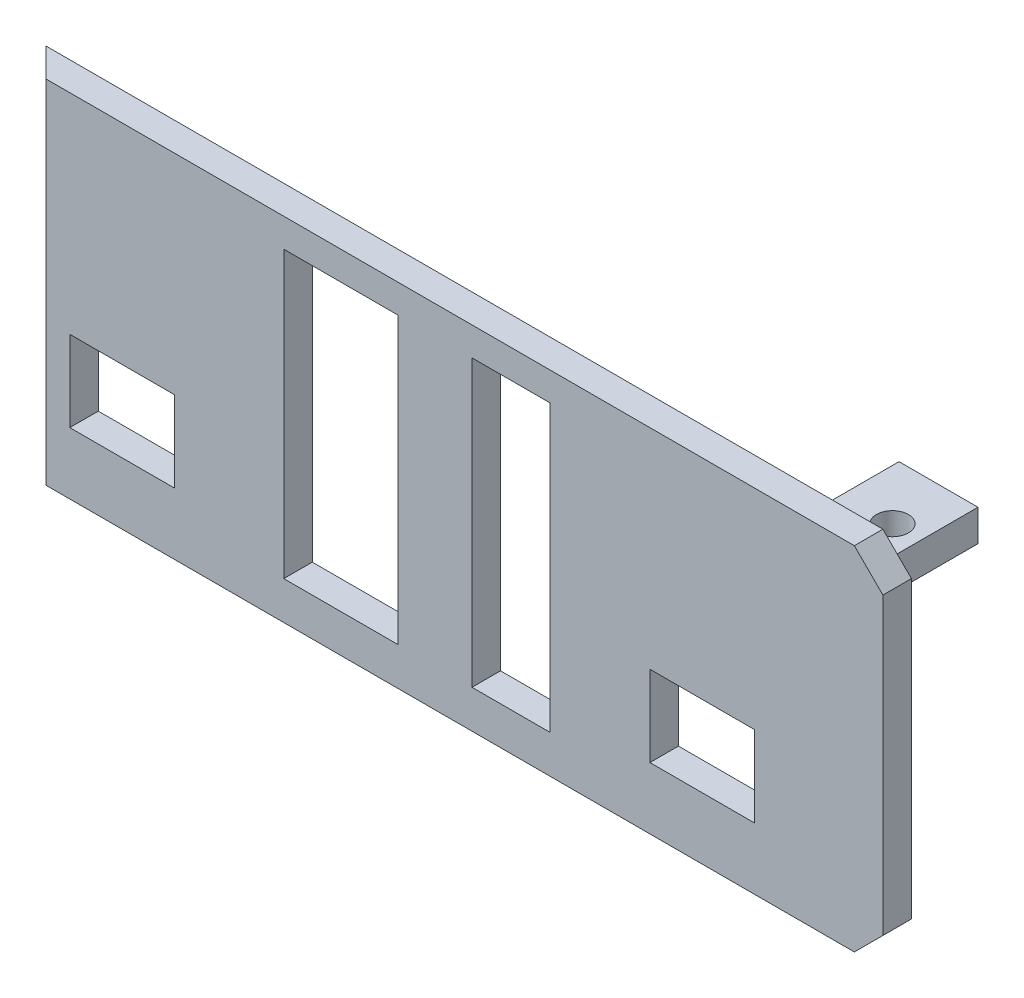
ISO-10303-21;
HEADER;
FILE_DESCRIPTION(('STEP AP214'),'2;1');
FILE_NAME('part.step','',(''),(''),'','','');
FILE_SCHEMA(('AUTOMOTIVE_DESIGN { 1 0 10303 214 1 1 1 1 }'));
ENDSEC;
DATA;
#1=APPLICATION_CONTEXT('core data for automotive mechanical design processes');
#2=APPLICATION_PROTOCOL_DEFINITION('international standard','automotive_design',2000,#1);
#3=PRODUCT_CONTEXT('',#1,'mechanical');
#4=PRODUCT('Part','Part','',(#3));
#5=PRODUCT_RELATED_PRODUCT_CATEGORY('part','',(#4));
#6=PRODUCT_DEFINITION_FORMATION('','',#4);
#7=PRODUCT_DEFINITION_CONTEXT('part definition',#1,'design');
#8=PRODUCT_DEFINITION('design','',#6,#7);
#9=PRODUCT_DEFINITION_SHAPE('','',#8);
#10=(LENGTH_UNIT() NAMED_UNIT(*) SI_UNIT(.MILLI.,.METRE.));
#11=(NAMED_UNIT(*) PLANE_ANGLE_UNIT() SI_UNIT($,.RADIAN.));
#12=(NAMED_UNIT(*) SI_UNIT($,.STERADIAN.) SOLID_ANGLE_UNIT());
#13=UNCERTAINTY_MEASURE_WITH_UNIT(LENGTH_MEASURE(1.E-05),#10,'distance_accuracy_value','');
#14=(GEOMETRIC_REPRESENTATION_CONTEXT(3) GLOBAL_UNCERTAINTY_ASSIGNED_CONTEXT((#13)) GLOBAL_UNIT_ASSIGNED_CONTEXT((#10,
#11,#12)) REPRESENTATION_CONTEXT('',''));
#15=CARTESIAN_POINT('',(0.,0.,0.));
#16=DIRECTION('',(0.,0.,1.));
#17=DIRECTION('',(1.,0.,0.));
#18=AXIS2_PLACEMENT_3D('',#15,#16,#17);
#19=CARTESIAN_POINT('',(0.,0.,0.));
#20=DIRECTION('',(0.,0.,-1.));
#21=DIRECTION('',(-1.,0.,0.));
#22=AXIS2_PLACEMENT_3D('',#19,#20,#21);
#23=PLANE('',#22);
#24=DIRECTION('',(0.,1.,0.));
#25=VECTOR('',#24,1.);
#26=CARTESIAN_POINT('',(-17.5000000000004,15.4999999999999,0.));
#27=LINE('',#26,#25);
#28=CARTESIAN_POINT('',(-17.5000000000004,-14.5,0.));
#29=VERTEX_POINT('',#28);
#30=CARTESIAN_POINT('',(-17.5000000000004,15.4999999999999,0.));
#31=VERTEX_POINT('',#30);
#32=EDGE_CURVE('E252',#29,#31,#27,.T.);
#33=ORIENTED_EDGE('',*,*,#32,.F.);
#34=DIRECTION('',(-1.,0.,0.));
#35=VECTOR('',#34,1.);
#36=CARTESIAN_POINT('',(-17.5000000000004,-14.5,0.));
#37=LINE('',#36,#35);
#38=CARTESIAN_POINT('',(-5.49999999999989,-14.5,0.));
#39=VERTEX_POINT('',#38);
#40=EDGE_CURVE('E261',#39,#29,#37,.T.);
#41=ORIENTED_EDGE('',*,*,#40,.F.);
#42=DIRECTION('',(0.,-1.,0.));
#43=VECTOR('',#42,1.);
#44=CARTESIAN_POINT('',(-5.49999999999988,15.5,0.));
#45=LINE('',#44,#43);
#46=CARTESIAN_POINT('',(-5.49999999999988,15.5,0.));
#47=VERTEX_POINT('',#46);
#48=EDGE_CURVE('E258',#47,#39,#45,.T.);
#49=ORIENTED_EDGE('',*,*,#48,.F.);
#50=DIRECTION('',(1.,0.,0.));
#51=VECTOR('',#50,1.);
#52=CARTESIAN_POINT('',(-17.5000000000004,15.4999999999999,0.));
#53=LINE('',#52,#51);
#54=EDGE_CURVE('E254',#31,#47,#53,.T.);
#55=ORIENTED_EDGE('',*,*,#54,.F.);
#56=EDGE_LOOP('',(#33,#41,#49,#55));
#57=FACE_BOUND('',#56,.T.);
#58=DIRECTION('',(0.,1.,0.));
#59=VECTOR('',#58,1.);
#60=CARTESIAN_POINT('',(2.29246455860621,15.5,0.));
#61=LINE('',#60,#59);
#62=CARTESIAN_POINT('',(2.29246455860621,-14.5,0.));
#63=VERTEX_POINT('',#62);
#64=CARTESIAN_POINT('',(2.29246455860621,15.5,0.));
#65=VERTEX_POINT('',#64);
#66=EDGE_CURVE('E255',#63,#65,#61,.T.);
#67=ORIENTED_EDGE('',*,*,#66,.F.);
#68=DIRECTION('',(-1.,0.,0.));
#69=VECTOR('',#68,1.);
#70=CARTESIAN_POINT('',(2.29246455860621,-14.5,0.));
#71=LINE('',#70,#69);
#72=CARTESIAN_POINT('',(10.5000000000001,-14.5,0.));
#73=VERTEX_POINT('',#72);
#74=EDGE_CURVE('E277',#73,#63,#71,.T.);
#75=ORIENTED_EDGE('',*,*,#74,.F.);
#76=DIRECTION('',(0.,-1.,0.));
#77=VECTOR('',#76,1.);
#78=CARTESIAN_POINT('',(10.5000000000001,15.5,0.));
#79=LINE('',#78,#77);
#80=CARTESIAN_POINT('',(10.5000000000001,15.5,0.));
#81=VERTEX_POINT('',#80);
#82=EDGE_CURVE('E283',#81,#73,#79,.T.);
#83=ORIENTED_EDGE('',*,*,#82,.F.);
#84=DIRECTION('',(1.,0.,0.));
#85=VECTOR('',#84,1.);
#86=CARTESIAN_POINT('',(2.29246455860621,15.5,0.));
#87=LINE('',#86,#85);
#88=EDGE_CURVE('E286',#65,#81,#87,.T.);
#89=ORIENTED_EDGE('',*,*,#88,.F.);
#90=EDGE_LOOP('',(#67,#75,#83,#89));
#91=FACE_BOUND('',#90,.T.);
#92=DIRECTION('',(0.,1.,0.));
#93=VECTOR('',#92,1.);
#94=CARTESIAN_POINT('',(-40.,0.,0.));
#95=LINE('',#94,#93);
#96=CARTESIAN_POINT('',(-40.,-11.9999999999999,0.));
#97=VERTEX_POINT('',#96);
#98=CARTESIAN_POINT('',(-40.,-3.49999999999987,0.));
#99=VERTEX_POINT('',#98);
#100=EDGE_CURVE('E392',#97,#99,#95,.T.);
#101=ORIENTED_EDGE('',*,*,#100,.F.);
#102=DIRECTION('',(-1.,0.,0.));
#103=VECTOR('',#102,1.);
#104=CARTESIAN_POINT('',(0.,-11.9999999999999,0.));
#105=LINE('',#104,#103);
#106=CARTESIAN_POINT('',(-29.,-11.9999999999999,0.));
#107=VERTEX_POINT('',#106);
#108=EDGE_CURVE('E385',#107,#97,#105,.T.);
#109=ORIENTED_EDGE('',*,*,#108,.F.);
#110=DIRECTION('',(0.,-1.,0.));
#111=VECTOR('',#110,1.);
#112=CARTESIAN_POINT('',(-29.,0.,0.));
#113=LINE('',#112,#111);
#114=CARTESIAN_POINT('',(-29.,-3.49999999999987,0.));
#115=VERTEX_POINT('',#114);
#116=EDGE_CURVE('E387',#115,#107,#113,.T.);
#117=ORIENTED_EDGE('',*,*,#116,.F.);
#118=DIRECTION('',(1.,0.,0.));
#119=VECTOR('',#118,1.);
#120=CARTESIAN_POINT('',(0.,-3.49999999999987,0.));
#121=LINE('',#120,#119);
#122=EDGE_CURVE('E390',#99,#115,#121,.T.);
#123=ORIENTED_EDGE('',*,*,#122,.F.);
#124=EDGE_LOOP('',(#101,#109,#117,#123));
#125=FACE_BOUND('',#124,.T.);
#126=DIRECTION('',(0.,1.,0.));
#127=VECTOR('',#126,1.);
#128=CARTESIAN_POINT('',(21.0000000000001,0.,0.));
#129=LINE('',#128,#127);
#130=CARTESIAN_POINT('',(21.0000000000001,-11.9999999999998,0.));
#131=VERTEX_POINT('',#130);
#132=CARTESIAN_POINT('',(21.0000000000001,-3.49999999999983,0.));
#133=VERTEX_POINT('',#132);
#134=EDGE_CURVE('E383',#131,#133,#129,.T.);
#135=ORIENTED_EDGE('',*,*,#134,.F.);
#136=DIRECTION('',(-1.,0.,0.));
#137=VECTOR('',#136,1.);
#138=CARTESIAN_POINT('',(0.,-11.9999999999998,0.));
#139=LINE('',#138,#137);
#140=CARTESIAN_POINT('',(32.0000000000001,-11.9999999999998,0.));
#141=VERTEX_POINT('',#140);
#142=EDGE_CURVE('E376',#141,#131,#139,.T.);
#143=ORIENTED_EDGE('',*,*,#142,.F.);
#144=DIRECTION('',(0.,-1.,0.));
#145=VECTOR('',#144,1.);
#146=CARTESIAN_POINT('',(32.0000000000001,0.,0.));
#147=LINE('',#146,#145);
#148=CARTESIAN_POINT('',(32.0000000000001,-3.49999999999983,0.));
#149=VERTEX_POINT('',#148);
#150=EDGE_CURVE('E378',#149,#141,#147,.T.);
#151=ORIENTED_EDGE('',*,*,#150,.F.);
#152=DIRECTION('',(1.,0.,0.));
#153=VECTOR('',#152,1.);
#154=CARTESIAN_POINT('',(0.,-3.49999999999984,0.));
#155=LINE('',#154,#153);
#156=EDGE_CURVE('E381',#133,#149,#155,.T.);
#157=ORIENTED_EDGE('',*,*,#156,.F.);
#158=EDGE_LOOP('',(#135,#143,#151,#157));
#159=FACE_BOUND('',#158,.T.);
#160=DIRECTION('',(0.,1.,0.));
#161=VECTOR('',#160,1.);
#162=CARTESIAN_POINT('',(45.5,-18.5,0.));
#163=LINE('',#162,#161);
#164=CARTESIAN_POINT('',(45.5,-15.5,0.));
#165=VERTEX_POINT('',#164);
#166=CARTESIAN_POINT('',(45.5,15.5,0.));
#167=VERTEX_POINT('',#166);
#168=EDGE_CURVE('E329',#165,#167,#163,.T.);
#169=ORIENTED_EDGE('',*,*,#168,.F.);
#170=DIRECTION('',(0.707106781186549,0.707106781186546,0.));
#171=VECTOR('',#170,1.);
#172=CARTESIAN_POINT('',(30.4999999999999,-30.5,0.));
#173=LINE('',#172,#171);
#174=CARTESIAN_POINT('',(42.5,-18.5,0.));
#175=VERTEX_POINT('',#174);
#176=EDGE_CURVE('E68',#165,#175,#173,.F.);
#177=ORIENTED_EDGE('',*,*,#176,.T.);
#178=DIRECTION('',(1.,0.,0.));
#179=VECTOR('',#178,1.);
#180=CARTESIAN_POINT('',(-45.5,-18.5,0.));
#181=LINE('',#180,#179);
#182=CARTESIAN_POINT('',(-45.5,-18.5,0.));
#183=VERTEX_POINT('',#182);
#184=EDGE_CURVE('E357',#183,#175,#181,.T.);
#185=ORIENTED_EDGE('',*,*,#184,.F.);
#186=DIRECTION('',(0.,-1.,0.));
#187=VECTOR('',#186,1.);
#188=CARTESIAN_POINT('',(-45.5,-18.5,0.));
#189=LINE('',#188,#187);
#190=CARTESIAN_POINT('',(-45.5,18.5,0.));
#191=VERTEX_POINT('',#190);
#192=EDGE_CURVE('E365',#191,#183,#189,.T.);
#193=ORIENTED_EDGE('',*,*,#192,.F.);
#194=DIRECTION('',(-1.,0.,0.));
#195=VECTOR('',#194,1.);
#196=CARTESIAN_POINT('',(-45.5,18.5,0.));
#197=LINE('',#196,#195);
#198=CARTESIAN_POINT('',(42.5,18.5,0.));
#199=VERTEX_POINT('',#198);
#200=EDGE_CURVE('E363',#199,#191,#197,.T.);
#201=ORIENTED_EDGE('',*,*,#200,.F.);
#202=DIRECTION('',(-0.707106781186544,0.707106781186551,0.));
#203=VECTOR('',#202,1.);
#204=CARTESIAN_POINT('',(30.5000000000002,30.4999999999999,0.));
#205=LINE('',#204,#203);
#206=EDGE_CURVE('E397',#199,#167,#205,.F.);
#207=ORIENTED_EDGE('',*,*,#206,.T.);
#208=EDGE_LOOP('',(#169,#177,#185,#193,#201,#207));
#209=FACE_BOUND('',#208,.T.);
#210=DIRECTION('',(-1.,0.,0.));
#211=VECTOR('',#210,1.);
#212=CARTESIAN_POINT('',(42.5,12.1806871060608,0.));
#213=LINE('',#212,#211);
#214=CARTESIAN_POINT('',(42.5,12.1806871060608,0.));
#215=VERTEX_POINT('',#214);
#216=CARTESIAN_POINT('',(34.1946625321552,12.1806871060608,0.));
#217=VERTEX_POINT('',#216);
#218=EDGE_CURVE('E579',#215,#217,#213,.T.);
#219=ORIENTED_EDGE('',*,*,#218,.F.);
#220=DIRECTION('',(0.,-1.,0.));
#221=VECTOR('',#220,1.);
#222=CARTESIAN_POINT('',(42.5,15.5,0.));
#223=LINE('',#222,#221);
#224=CARTESIAN_POINT('',(42.5,15.5,0.));
#225=VERTEX_POINT('',#224);
#226=EDGE_CURVE('E242',#225,#215,#223,.T.);
#227=ORIENTED_EDGE('',*,*,#226,.F.);
#228=DIRECTION('',(1.,0.,0.));
#229=VECTOR('',#228,1.);
#230=CARTESIAN_POINT('',(42.5,15.5,0.));
#231=LINE('',#230,#229);
#232=CARTESIAN_POINT('',(34.1946625321552,15.5,0.));
#233=VERTEX_POINT('',#232);
#234=EDGE_CURVE('E238',#233,#225,#231,.T.);
#235=ORIENTED_EDGE('',*,*,#234,.F.);
#236=DIRECTION('',(0.,1.,0.));
#237=VECTOR('',#236,1.);
#238=CARTESIAN_POINT('',(34.1946625321552,15.5,0.));
#239=LINE('',#238,#237);
#240=EDGE_CURVE('E587',#217,#233,#239,.T.);
#241=ORIENTED_EDGE('',*,*,#240,.F.);
#242=EDGE_LOOP('',(#219,#227,#235,#241));
#243=FACE_BOUND('',#242,.T.);
#244=ADVANCED_FACE('F45',(#57,#91,#125,#159,#209,#243),#23,.T.);
#245=CARTESIAN_POINT('',(45.5,-18.5,3.));
#246=DIRECTION('',(-1.,0.,0.));
#247=DIRECTION('',(0.,0.,1.));
#248=AXIS2_PLACEMENT_3D('',#245,#246,#247);
#249=PLANE('',#248);
#250=DIRECTION('',(0.,1.,0.));
#251=VECTOR('',#250,1.);
#252=CARTESIAN_POINT('',(45.5,-18.5,3.));
#253=LINE('',#252,#251);
#254=CARTESIAN_POINT('',(45.5,-15.5,3.));
#255=VERTEX_POINT('',#254);
#256=CARTESIAN_POINT('',(45.5,15.5,3.));
#257=VERTEX_POINT('',#256);
#258=EDGE_CURVE('E354',#255,#257,#253,.T.);
#259=ORIENTED_EDGE('',*,*,#258,.F.);
#260=DIRECTION('',(0.,0.,-1.));
#261=VECTOR('',#260,1.);
#262=CARTESIAN_POINT('',(45.5,-15.5,3.));
#263=LINE('',#262,#261);
#264=EDGE_CURVE('E405',#255,#165,#263,.T.);
#265=ORIENTED_EDGE('',*,*,#264,.T.);
#266=ORIENTED_EDGE('',*,*,#168,.T.);
#267=DIRECTION('',(0.,0.,1.));
#268=VECTOR('',#267,1.);
#269=CARTESIAN_POINT('',(45.5,15.5,3.));
#270=LINE('',#269,#268);
#271=EDGE_CURVE('E400',#167,#257,#270,.T.);
#272=ORIENTED_EDGE('',*,*,#271,.T.);
#273=EDGE_LOOP('',(#259,#265,#266,#272));
#274=FACE_BOUND('',#273,.T.);
#275=ADVANCED_FACE('F411',(#274),#249,.F.);
#276=CARTESIAN_POINT('',(-45.5,18.5,3.));
#277=DIRECTION('',(0.,-1.,0.));
#278=DIRECTION('',(0.,0.,-1.));
#279=AXIS2_PLACEMENT_3D('',#276,#277,#278);
#280=PLANE('',#279);
#281=DIRECTION('',(-1.,0.,0.));
#282=VECTOR('',#281,1.);
#283=CARTESIAN_POINT('',(-45.5,18.5,3.));
#284=LINE('',#283,#282);
#285=CARTESIAN_POINT('',(42.5,18.5,3.));
#286=VERTEX_POINT('',#285);
#287=CARTESIAN_POINT('',(-42.5,18.5,3.));
#288=VERTEX_POINT('',#287);
#289=EDGE_CURVE('E356',#286,#288,#284,.T.);
#290=ORIENTED_EDGE('',*,*,#289,.F.);
#291=DIRECTION('',(0.,0.,-1.));
#292=VECTOR('',#291,1.);
#293=CARTESIAN_POINT('',(42.5,18.5,3.));
#294=LINE('',#293,#292);
#295=EDGE_CURVE('E394',#286,#199,#294,.T.);
#296=ORIENTED_EDGE('',*,*,#295,.T.);
#297=ORIENTED_EDGE('',*,*,#200,.T.);
#298=DIRECTION('',(-0.707106781186546,0.,-0.707106781186549));
#299=VECTOR('',#298,1.);
#300=CARTESIAN_POINT('',(-42.5,18.5,3.));
#301=LINE('',#300,#299);
#302=EDGE_CURVE('E373',#191,#288,#301,.F.);
#303=ORIENTED_EDGE('',*,*,#302,.T.);
#304=EDGE_LOOP('',(#290,#296,#297,#303));
#305=FACE_BOUND('',#304,.T.);
#306=ADVANCED_FACE('F426',(#305),#280,.F.);
#307=CARTESIAN_POINT('',(-45.5,-18.5,3.));
#308=DIRECTION('',(0.,1.,0.));
#309=DIRECTION('',(0.,0.,1.));
#310=AXIS2_PLACEMENT_3D('',#307,#308,#309);
#311=PLANE('',#310);
#312=ORIENTED_EDGE('',*,*,#184,.T.);
#313=DIRECTION('',(0.,0.,1.));
#314=VECTOR('',#313,1.);
#315=CARTESIAN_POINT('',(42.5,-18.5,3.));
#316=LINE('',#315,#314);
#317=CARTESIAN_POINT('',(42.5,-18.5,3.));
#318=VERTEX_POINT('',#317);
#319=EDGE_CURVE('E54',#175,#318,#316,.T.);
#320=ORIENTED_EDGE('',*,*,#319,.T.);
#321=DIRECTION('',(1.,0.,0.));
#322=VECTOR('',#321,1.);
#323=CARTESIAN_POINT('',(-45.5,-18.5,3.));
#324=LINE('',#323,#322);
#325=CARTESIAN_POINT('',(-42.5,-18.5,3.));
#326=VERTEX_POINT('',#325);
#327=EDGE_CURVE('E359',#326,#318,#324,.T.);
#328=ORIENTED_EDGE('',*,*,#327,.F.);
#329=DIRECTION('',(0.707106781186546,0.,0.707106781186549));
#330=VECTOR('',#329,1.);
#331=CARTESIAN_POINT('',(-42.5,-18.5,3.));
#332=LINE('',#331,#330);
#333=EDGE_CURVE('E371',#326,#183,#332,.F.);
#334=ORIENTED_EDGE('',*,*,#333,.T.);
#335=EDGE_LOOP('',(#312,#320,#328,#334));
#336=FACE_BOUND('',#335,.T.);
#337=ADVANCED_FACE('F431',(#336),#311,.F.);
#338=CARTESIAN_POINT('',(0.,0.,3.));
#339=DIRECTION('',(0.,0.,-1.));
#340=DIRECTION('',(-1.,0.,0.));
#341=AXIS2_PLACEMENT_3D('',#338,#339,#340);
#342=PLANE('',#341);
#343=DIRECTION('',(-1.,0.,0.));
#344=VECTOR('',#343,1.);
#345=CARTESIAN_POINT('',(0.,-14.5,3.));
#346=LINE('',#345,#344);
#347=CARTESIAN_POINT('',(-5.49999999999989,-14.5,3.));
#348=VERTEX_POINT('',#347);
#349=CARTESIAN_POINT('',(-17.5000000000004,-14.5,3.));
#350=VERTEX_POINT('',#349);
#351=EDGE_CURVE('E307',#348,#350,#346,.T.);
#352=ORIENTED_EDGE('',*,*,#351,.T.);
#353=DIRECTION('',(0.,1.,0.));
#354=VECTOR('',#353,1.);
#355=CARTESIAN_POINT('',(-17.5000000000004,0.,3.));
#356=LINE('',#355,#354);
#357=CARTESIAN_POINT('',(-17.5000000000004,15.4999999999999,3.));
#358=VERTEX_POINT('',#357);
#359=EDGE_CURVE('E310',#350,#358,#356,.T.);
#360=ORIENTED_EDGE('',*,*,#359,.T.);
#361=DIRECTION('',(1.,0.,0.));
#362=VECTOR('',#361,1.);
#363=CARTESIAN_POINT('',(0.,15.5,3.));
#364=LINE('',#363,#362);
#365=CARTESIAN_POINT('',(-5.49999999999988,15.5,3.));
#366=VERTEX_POINT('',#365);
#367=EDGE_CURVE('E301',#358,#366,#364,.T.);
#368=ORIENTED_EDGE('',*,*,#367,.T.);
#369=DIRECTION('',(0.,-1.,0.));
#370=VECTOR('',#369,1.);
#371=CARTESIAN_POINT('',(-5.49999999999988,0.,3.));
#372=LINE('',#371,#370);
#373=EDGE_CURVE('E304',#366,#348,#372,.T.);
#374=ORIENTED_EDGE('',*,*,#373,.T.);
#375=EDGE_LOOP('',(#352,#360,#368,#374));
#376=FACE_BOUND('',#375,.T.);
#377=DIRECTION('',(-1.,0.,0.));
#378=VECTOR('',#377,1.);
#379=CARTESIAN_POINT('',(0.,-14.5,3.));
#380=LINE('',#379,#378);
#381=CARTESIAN_POINT('',(10.5000000000001,-14.5,3.));
#382=VERTEX_POINT('',#381);
#383=CARTESIAN_POINT('',(2.29246455860621,-14.5,3.));
#384=VERTEX_POINT('',#383);
#385=EDGE_CURVE('E295',#382,#384,#380,.T.);
#386=ORIENTED_EDGE('',*,*,#385,.T.);
#387=DIRECTION('',(0.,1.,0.));
#388=VECTOR('',#387,1.);
#389=CARTESIAN_POINT('',(2.29246455860621,0.,3.));
#390=LINE('',#389,#388);
#391=CARTESIAN_POINT('',(2.29246455860621,15.5,3.));
#392=VERTEX_POINT('',#391);
#393=EDGE_CURVE('E298',#384,#392,#390,.T.);
#394=ORIENTED_EDGE('',*,*,#393,.T.);
#395=DIRECTION('',(1.,0.,0.));
#396=VECTOR('',#395,1.);
#397=CARTESIAN_POINT('',(0.,15.5,3.));
#398=LINE('',#397,#396);
#399=CARTESIAN_POINT('',(10.5000000000001,15.5,3.));
#400=VERTEX_POINT('',#399);
#401=EDGE_CURVE('E267',#392,#400,#398,.T.);
#402=ORIENTED_EDGE('',*,*,#401,.T.);
#403=DIRECTION('',(0.,-1.,0.));
#404=VECTOR('',#403,1.);
#405=CARTESIAN_POINT('',(10.5000000000001,0.,3.));
#406=LINE('',#405,#404);
#407=EDGE_CURVE('E292',#400,#382,#406,.T.);
#408=ORIENTED_EDGE('',*,*,#407,.T.);
#409=EDGE_LOOP('',(#386,#394,#402,#408));
#410=FACE_BOUND('',#409,.T.);
#411=DIRECTION('',(1.,0.,0.));
#412=VECTOR('',#411,1.);
#413=CARTESIAN_POINT('',(-40.,-11.9999999999999,3.));
#414=LINE('',#413,#412);
#415=CARTESIAN_POINT('',(-40.,-11.9999999999999,3.));
#416=VERTEX_POINT('',#415);
#417=CARTESIAN_POINT('',(-29.,-11.9999999999999,3.));
#418=VERTEX_POINT('',#417);
#419=EDGE_CURVE('E316',#416,#418,#414,.T.);
#420=ORIENTED_EDGE('',*,*,#419,.F.);
#421=DIRECTION('',(0.,-1.,0.));
#422=VECTOR('',#421,1.);
#423=CARTESIAN_POINT('',(-40.,-11.9999999999999,3.));
#424=LINE('',#423,#422);
#425=CARTESIAN_POINT('',(-40.,-3.49999999999987,3.));
#426=VERTEX_POINT('',#425);
#427=EDGE_CURVE('E314',#426,#416,#424,.T.);
#428=ORIENTED_EDGE('',*,*,#427,.F.);
#429=DIRECTION('',(-1.,0.,0.));
#430=VECTOR('',#429,1.);
#431=CARTESIAN_POINT('',(-40.,-3.49999999999987,3.));
#432=LINE('',#431,#430);
#433=CARTESIAN_POINT('',(-29.,-3.49999999999987,3.));
#434=VERTEX_POINT('',#433);
#435=EDGE_CURVE('E323',#434,#426,#432,.T.);
#436=ORIENTED_EDGE('',*,*,#435,.F.);
#437=DIRECTION('',(0.,1.,0.));
#438=VECTOR('',#437,1.);
#439=CARTESIAN_POINT('',(-29.,-11.9999999999999,3.));
#440=LINE('',#439,#438);
#441=EDGE_CURVE('E320',#418,#434,#440,.T.);
#442=ORIENTED_EDGE('',*,*,#441,.F.);
#443=EDGE_LOOP('',(#420,#428,#436,#442));
#444=FACE_BOUND('',#443,.T.);
#445=DIRECTION('',(1.,0.,0.));
#446=VECTOR('',#445,1.);
#447=CARTESIAN_POINT('',(21.0000000000001,-11.9999999999998,3.));
#448=LINE('',#447,#446);
#449=CARTESIAN_POINT('',(21.0000000000001,-11.9999999999998,3.));
#450=VERTEX_POINT('',#449);
#451=CARTESIAN_POINT('',(32.0000000000001,-11.9999999999998,3.));
#452=VERTEX_POINT('',#451);
#453=EDGE_CURVE('E350',#450,#452,#448,.T.);
#454=ORIENTED_EDGE('',*,*,#453,.F.);
#455=DIRECTION('',(0.,-1.,0.));
#456=VECTOR('',#455,1.);
#457=CARTESIAN_POINT('',(21.0000000000001,-11.9999999999998,3.));
#458=LINE('',#457,#456);
#459=CARTESIAN_POINT('',(21.0000000000001,-3.49999999999983,3.));
#460=VERTEX_POINT('',#459);
#461=EDGE_CURVE('E317',#460,#450,#458,.T.);
#462=ORIENTED_EDGE('',*,*,#461,.F.);
#463=DIRECTION('',(-1.,0.,0.));
#464=VECTOR('',#463,1.);
#465=CARTESIAN_POINT('',(21.0000000000001,-3.49999999999983,3.));
#466=LINE('',#465,#464);
#467=CARTESIAN_POINT('',(32.0000000000001,-3.49999999999983,3.));
#468=VERTEX_POINT('',#467);
#469=EDGE_CURVE('E339',#468,#460,#466,.T.);
#470=ORIENTED_EDGE('',*,*,#469,.F.);
#471=DIRECTION('',(0.,1.,0.));
#472=VECTOR('',#471,1.);
#473=CARTESIAN_POINT('',(32.0000000000001,-11.9999999999998,3.));
#474=LINE('',#473,#472);
#475=EDGE_CURVE('E347',#452,#468,#474,.T.);
#476=ORIENTED_EDGE('',*,*,#475,.F.);
#477=EDGE_LOOP('',(#454,#462,#470,#476));
#478=FACE_BOUND('',#477,.T.);
#479=ORIENTED_EDGE('',*,*,#327,.T.);
#480=DIRECTION('',(-0.707106781186549,-0.707106781186546,0.));
#481=VECTOR('',#480,1.);
#482=CARTESIAN_POINT('',(45.5,-15.5,3.));
#483=LINE('',#482,#481);
#484=EDGE_CURVE('E11',#318,#255,#483,.F.);
#485=ORIENTED_EDGE('',*,*,#484,.T.);
#486=ORIENTED_EDGE('',*,*,#258,.T.);
#487=DIRECTION('',(0.707106781186544,-0.707106781186551,0.));
#488=VECTOR('',#487,1.);
#489=CARTESIAN_POINT('',(42.5,18.5,3.));
#490=LINE('',#489,#488);
#491=EDGE_CURVE('E403',#257,#286,#490,.F.);
#492=ORIENTED_EDGE('',*,*,#491,.T.);
#493=ORIENTED_EDGE('',*,*,#289,.T.);
#494=DIRECTION('',(0.,-1.,0.));
#495=VECTOR('',#494,1.);
#496=CARTESIAN_POINT('',(-42.5,0.,3.));
#497=LINE('',#496,#495);
#498=EDGE_CURVE('E361',#288,#326,#497,.T.);
#499=ORIENTED_EDGE('',*,*,#498,.T.);
#500=EDGE_LOOP('',(#479,#485,#486,#492,#493,#499));
#501=FACE_BOUND('',#500,.T.);
#502=ADVANCED_FACE('F424',(#376,#410,#444,#478,#501),#342,.F.);
#503=CARTESIAN_POINT('',(-42.5,0.,3.));
#504=DIRECTION('',(0.707106781186549,0.,-0.707106781186546));
#505=DIRECTION('',(0.,-1.,0.));
#506=AXIS2_PLACEMENT_3D('',#503,#504,#505);
#507=PLANE('',#506);
#508=ORIENTED_EDGE('',*,*,#302,.F.);
#509=ORIENTED_EDGE('',*,*,#192,.T.);
#510=ORIENTED_EDGE('',*,*,#333,.F.);
#511=ORIENTED_EDGE('',*,*,#498,.F.);
#512=EDGE_LOOP('',(#508,#509,#510,#511));
#513=FACE_BOUND('',#512,.T.);
#514=ADVANCED_FACE('F430',(#513),#507,.F.);
#515=CARTESIAN_POINT('',(21.0000000000001,-11.9999999999998,-7.));
#516=DIRECTION('',(-1.,0.,0.));
#517=DIRECTION('',(0.,-1.,0.));
#518=AXIS2_PLACEMENT_3D('',#515,#516,#517);
#519=PLANE('',#518);
#520=ORIENTED_EDGE('',*,*,#134,.T.);
#521=DIRECTION('',(0.,0.,1.));
#522=VECTOR('',#521,1.);
#523=CARTESIAN_POINT('',(21.0000000000001,-3.49999999999983,-7.));
#524=LINE('',#523,#522);
#525=EDGE_CURVE('E313',#133,#460,#524,.T.);
#526=ORIENTED_EDGE('',*,*,#525,.T.);
#527=ORIENTED_EDGE('',*,*,#461,.T.);
#528=DIRECTION('',(0.,0.,1.));
#529=VECTOR('',#528,1.);
#530=CARTESIAN_POINT('',(21.0000000000001,-11.9999999999998,-7.));
#531=LINE('',#530,#529);
#532=EDGE_CURVE('E336',#131,#450,#531,.T.);
#533=ORIENTED_EDGE('',*,*,#532,.F.);
#534=EDGE_LOOP('',(#520,#526,#527,#533));
#535=FACE_BOUND('',#534,.T.);
#536=ADVANCED_FACE('F459',(#535),#519,.F.);
#537=CARTESIAN_POINT('',(21.0000000000001,-3.49999999999983,-7.));
#538=DIRECTION('',(0.,1.,0.));
#539=DIRECTION('',(-1.,0.,0.));
#540=AXIS2_PLACEMENT_3D('',#537,#538,#539);
#541=PLANE('',#540);
#542=ORIENTED_EDGE('',*,*,#156,.T.);
#543=DIRECTION('',(0.,0.,1.));
#544=VECTOR('',#543,1.);
#545=CARTESIAN_POINT('',(32.0000000000001,-3.49999999999983,-7.));
#546=LINE('',#545,#544);
#547=EDGE_CURVE('E342',#149,#468,#546,.T.);
#548=ORIENTED_EDGE('',*,*,#547,.T.);
#549=ORIENTED_EDGE('',*,*,#469,.T.);
#550=ORIENTED_EDGE('',*,*,#525,.F.);
#551=EDGE_LOOP('',(#542,#548,#549,#550));
#552=FACE_BOUND('',#551,.T.);
#553=ADVANCED_FACE('F467',(#552),#541,.F.);
#554=CARTESIAN_POINT('',(32.0000000000001,-11.9999999999998,-7.));
#555=DIRECTION('',(1.,0.,0.));
#556=DIRECTION('',(0.,0.,-1.));
#557=AXIS2_PLACEMENT_3D('',#554,#555,#556);
#558=PLANE('',#557);
#559=ORIENTED_EDGE('',*,*,#150,.T.);
#560=DIRECTION('',(0.,0.,1.));
#561=VECTOR('',#560,1.);
#562=CARTESIAN_POINT('',(32.0000000000001,-11.9999999999998,-7.));
#563=LINE('',#562,#561);
#564=EDGE_CURVE('E340',#141,#452,#563,.T.);
#565=ORIENTED_EDGE('',*,*,#564,.T.);
#566=ORIENTED_EDGE('',*,*,#475,.T.);
#567=ORIENTED_EDGE('',*,*,#547,.F.);
#568=EDGE_LOOP('',(#559,#565,#566,#567));
#569=FACE_BOUND('',#568,.T.);
#570=ADVANCED_FACE('F495',(#569),#558,.F.);
#571=CARTESIAN_POINT('',(21.0000000000001,-11.9999999999998,-7.));
#572=DIRECTION('',(0.,-1.,0.));
#573=DIRECTION('',(0.,0.,-1.));
#574=AXIS2_PLACEMENT_3D('',#571,#572,#573);
#575=PLANE('',#574);
#576=ORIENTED_EDGE('',*,*,#142,.T.);
#577=ORIENTED_EDGE('',*,*,#532,.T.);
#578=ORIENTED_EDGE('',*,*,#453,.T.);
#579=ORIENTED_EDGE('',*,*,#564,.F.);
#580=EDGE_LOOP('',(#576,#577,#578,#579));
#581=FACE_BOUND('',#580,.T.);
#582=ADVANCED_FACE('F484',(#581),#575,.F.);
#583=CARTESIAN_POINT('',(-40.,-11.9999999999999,-7.));
#584=DIRECTION('',(-1.,0.,0.));
#585=DIRECTION('',(0.,0.,1.));
#586=AXIS2_PLACEMENT_3D('',#583,#584,#585);
#587=PLANE('',#586);
#588=ORIENTED_EDGE('',*,*,#100,.T.);
#589=DIRECTION('',(0.,0.,1.));
#590=VECTOR('',#589,1.);
#591=CARTESIAN_POINT('',(-40.,-3.49999999999987,-7.));
#592=LINE('',#591,#590);
#593=EDGE_CURVE('E327',#99,#426,#592,.T.);
#594=ORIENTED_EDGE('',*,*,#593,.T.);
#595=ORIENTED_EDGE('',*,*,#427,.T.);
#596=DIRECTION('',(0.,0.,1.));
#597=VECTOR('',#596,1.);
#598=CARTESIAN_POINT('',(-40.,-11.9999999999999,-7.));
#599=LINE('',#598,#597);
#600=EDGE_CURVE('E326',#97,#416,#599,.T.);
#601=ORIENTED_EDGE('',*,*,#600,.F.);
#602=EDGE_LOOP('',(#588,#594,#595,#601));
#603=FACE_BOUND('',#602,.T.);
#604=ADVANCED_FACE('F502',(#603),#587,.F.);
#605=CARTESIAN_POINT('',(-40.,-3.49999999999987,-7.));
#606=DIRECTION('',(0.,1.,0.));
#607=DIRECTION('',(0.,0.,1.));
#608=AXIS2_PLACEMENT_3D('',#605,#606,#607);
#609=PLANE('',#608);
#610=ORIENTED_EDGE('',*,*,#122,.T.);
#611=DIRECTION('',(0.,0.,1.));
#612=VECTOR('',#611,1.);
#613=CARTESIAN_POINT('',(-29.,-3.49999999999987,-7.));
#614=LINE('',#613,#612);
#615=EDGE_CURVE('E330',#115,#434,#614,.T.);
#616=ORIENTED_EDGE('',*,*,#615,.T.);
#617=ORIENTED_EDGE('',*,*,#435,.T.);
#618=ORIENTED_EDGE('',*,*,#593,.F.);
#619=EDGE_LOOP('',(#610,#616,#617,#618));
#620=FACE_BOUND('',#619,.T.);
#621=ADVANCED_FACE('F507',(#620),#609,.F.);
#622=CARTESIAN_POINT('',(-29.,-11.9999999999999,-7.));
#623=DIRECTION('',(1.,0.,0.));
#624=DIRECTION('',(0.,0.,-1.));
#625=AXIS2_PLACEMENT_3D('',#622,#623,#624);
#626=PLANE('',#625);
#627=ORIENTED_EDGE('',*,*,#116,.T.);
#628=DIRECTION('',(0.,0.,1.));
#629=VECTOR('',#628,1.);
#630=CARTESIAN_POINT('',(-29.,-11.9999999999999,-7.));
#631=LINE('',#630,#629);
#632=EDGE_CURVE('E332',#107,#418,#631,.T.);
#633=ORIENTED_EDGE('',*,*,#632,.T.);
#634=ORIENTED_EDGE('',*,*,#441,.T.);
#635=ORIENTED_EDGE('',*,*,#615,.F.);
#636=EDGE_LOOP('',(#627,#633,#634,#635));
#637=FACE_BOUND('',#636,.T.);
#638=ADVANCED_FACE('F513',(#637),#626,.F.);
#639=CARTESIAN_POINT('',(-40.,-11.9999999999999,-7.));
#640=DIRECTION('',(0.,-1.,0.));
#641=DIRECTION('',(0.,0.,-1.));
#642=AXIS2_PLACEMENT_3D('',#639,#640,#641);
#643=PLANE('',#642);
#644=ORIENTED_EDGE('',*,*,#108,.T.);
#645=ORIENTED_EDGE('',*,*,#600,.T.);
#646=ORIENTED_EDGE('',*,*,#419,.T.);
#647=ORIENTED_EDGE('',*,*,#632,.F.);
#648=EDGE_LOOP('',(#644,#645,#646,#647));
#649=FACE_BOUND('',#648,.T.);
#650=ADVANCED_FACE('F509',(#649),#643,.F.);
#651=CARTESIAN_POINT('',(2.29246455860621,15.5,10.));
#652=DIRECTION('',(-1.,0.,0.));
#653=DIRECTION('',(0.,0.,1.));
#654=AXIS2_PLACEMENT_3D('',#651,#652,#653);
#655=PLANE('',#654);
#656=DIRECTION('',(0.,0.,-1.));
#657=VECTOR('',#656,1.);
#658=CARTESIAN_POINT('',(2.29246455860621,-14.5,10.));
#659=LINE('',#658,#657);
#660=EDGE_CURVE('E244',#384,#63,#659,.T.);
#661=ORIENTED_EDGE('',*,*,#660,.T.);
#662=ORIENTED_EDGE('',*,*,#66,.T.);
#663=DIRECTION('',(0.,0.,-1.));
#664=VECTOR('',#663,1.);
#665=CARTESIAN_POINT('',(2.29246455860621,15.5,10.));
#666=LINE('',#665,#664);
#667=EDGE_CURVE('E274',#392,#65,#666,.T.);
#668=ORIENTED_EDGE('',*,*,#667,.F.);
#669=ORIENTED_EDGE('',*,*,#393,.F.);
#670=EDGE_LOOP('',(#661,#662,#668,#669));
#671=FACE_BOUND('',#670,.T.);
#672=ADVANCED_FACE('F512',(#671),#655,.F.);
#673=CARTESIAN_POINT('',(2.29246455860621,-14.5,10.));
#674=DIRECTION('',(0.,-1.,0.));
#675=DIRECTION('',(1.,0.,0.));
#676=AXIS2_PLACEMENT_3D('',#673,#674,#675);
#677=PLANE('',#676);
#678=DIRECTION('',(0.,0.,-1.));
#679=VECTOR('',#678,1.);
#680=CARTESIAN_POINT('',(10.5000000000001,-14.5,10.));
#681=LINE('',#680,#679);
#682=EDGE_CURVE('E246',#382,#73,#681,.T.);
#683=ORIENTED_EDGE('',*,*,#682,.T.);
#684=ORIENTED_EDGE('',*,*,#74,.T.);
#685=ORIENTED_EDGE('',*,*,#660,.F.);
#686=ORIENTED_EDGE('',*,*,#385,.F.);
#687=EDGE_LOOP('',(#683,#684,#685,#686));
#688=FACE_BOUND('',#687,.T.);
#689=ADVANCED_FACE('F521',(#688),#677,.F.);
#690=CARTESIAN_POINT('',(10.5000000000001,15.5,10.));
#691=DIRECTION('',(1.,0.,0.));
#692=DIRECTION('',(0.,1.,0.));
#693=AXIS2_PLACEMENT_3D('',#690,#691,#692);
#694=PLANE('',#693);
#695=DIRECTION('',(0.,0.,-1.));
#696=VECTOR('',#695,1.);
#697=CARTESIAN_POINT('',(10.5000000000001,15.5,10.));
#698=LINE('',#697,#696);
#699=EDGE_CURVE('E278',#400,#81,#698,.T.);
#700=ORIENTED_EDGE('',*,*,#699,.T.);
#701=ORIENTED_EDGE('',*,*,#82,.T.);
#702=ORIENTED_EDGE('',*,*,#682,.F.);
#703=ORIENTED_EDGE('',*,*,#407,.F.);
#704=EDGE_LOOP('',(#700,#701,#702,#703));
#705=FACE_BOUND('',#704,.T.);
#706=ADVANCED_FACE('F524',(#705),#694,.F.);
#707=CARTESIAN_POINT('',(2.29246455860621,15.5,10.));
#708=DIRECTION('',(0.,1.,0.));
#709=DIRECTION('',(-1.,0.,0.));
#710=AXIS2_PLACEMENT_3D('',#707,#708,#709);
#711=PLANE('',#710);
#712=ORIENTED_EDGE('',*,*,#667,.T.);
#713=ORIENTED_EDGE('',*,*,#88,.T.);
#714=ORIENTED_EDGE('',*,*,#699,.F.);
#715=ORIENTED_EDGE('',*,*,#401,.F.);
#716=EDGE_LOOP('',(#712,#713,#714,#715));
#717=FACE_BOUND('',#716,.T.);
#718=ADVANCED_FACE('F528',(#717),#711,.F.);
#719=CARTESIAN_POINT('',(-17.5000000000004,15.4999999999999,10.));
#720=DIRECTION('',(-1.,0.,0.));
#721=DIRECTION('',(0.,0.,1.));
#722=AXIS2_PLACEMENT_3D('',#719,#720,#721);
#723=PLANE('',#722);
#724=DIRECTION('',(0.,0.,-1.));
#725=VECTOR('',#724,1.);
#726=CARTESIAN_POINT('',(-17.5000000000004,-14.5,10.));
#727=LINE('',#726,#725);
#728=EDGE_CURVE('E265',#350,#29,#727,.T.);
#729=ORIENTED_EDGE('',*,*,#728,.T.);
#730=ORIENTED_EDGE('',*,*,#32,.T.);
#731=DIRECTION('',(0.,0.,-1.));
#732=VECTOR('',#731,1.);
#733=CARTESIAN_POINT('',(-17.5000000000004,15.4999999999999,10.));
#734=LINE('',#733,#732);
#735=EDGE_CURVE('E264',#358,#31,#734,.T.);
#736=ORIENTED_EDGE('',*,*,#735,.F.);
#737=ORIENTED_EDGE('',*,*,#359,.F.);
#738=EDGE_LOOP('',(#729,#730,#736,#737));
#739=FACE_BOUND('',#738,.T.);
#740=ADVANCED_FACE('F532',(#739),#723,.F.);
#741=CARTESIAN_POINT('',(-17.5000000000004,-14.5,10.));
#742=DIRECTION('',(0.,-1.,0.));
#743=DIRECTION('',(1.,0.,0.));
#744=AXIS2_PLACEMENT_3D('',#741,#742,#743);
#745=PLANE('',#744);
#746=DIRECTION('',(0.,0.,-1.));
#747=VECTOR('',#746,1.);
#748=CARTESIAN_POINT('',(-5.49999999999989,-14.5,10.));
#749=LINE('',#748,#747);
#750=EDGE_CURVE('E268',#348,#39,#749,.T.);
#751=ORIENTED_EDGE('',*,*,#750,.T.);
#752=ORIENTED_EDGE('',*,*,#40,.T.);
#753=ORIENTED_EDGE('',*,*,#728,.F.);
#754=ORIENTED_EDGE('',*,*,#351,.F.);
#755=EDGE_LOOP('',(#751,#752,#753,#754));
#756=FACE_BOUND('',#755,.T.);
#757=ADVANCED_FACE('F539',(#756),#745,.F.);
#758=CARTESIAN_POINT('',(-5.49999999999988,15.5,10.));
#759=DIRECTION('',(1.,0.,0.));
#760=DIRECTION('',(0.,1.,0.));
#761=AXIS2_PLACEMENT_3D('',#758,#759,#760);
#762=PLANE('',#761);
#763=DIRECTION('',(0.,0.,-1.));
#764=VECTOR('',#763,1.);
#765=CARTESIAN_POINT('',(-5.49999999999988,15.5,10.));
#766=LINE('',#765,#764);
#767=EDGE_CURVE('E270',#366,#47,#766,.T.);
#768=ORIENTED_EDGE('',*,*,#767,.T.);
#769=ORIENTED_EDGE('',*,*,#48,.T.);
#770=ORIENTED_EDGE('',*,*,#750,.F.);
#771=ORIENTED_EDGE('',*,*,#373,.F.);
#772=EDGE_LOOP('',(#768,#769,#770,#771));
#773=FACE_BOUND('',#772,.T.);
#774=ADVANCED_FACE('F544',(#773),#762,.F.);
#775=CARTESIAN_POINT('',(-17.5000000000004,15.4999999999999,10.));
#776=DIRECTION('',(0.,1.,0.));
#777=DIRECTION('',(-1.,0.,0.));
#778=AXIS2_PLACEMENT_3D('',#775,#776,#777);
#779=PLANE('',#778);
#780=ORIENTED_EDGE('',*,*,#735,.T.);
#781=ORIENTED_EDGE('',*,*,#54,.T.);
#782=ORIENTED_EDGE('',*,*,#767,.F.);
#783=ORIENTED_EDGE('',*,*,#367,.F.);
#784=EDGE_LOOP('',(#780,#781,#782,#783));
#785=FACE_BOUND('',#784,.T.);
#786=ADVANCED_FACE('F541',(#785),#779,.F.);
#787=CARTESIAN_POINT('',(42.5,15.5,-10.));
#788=DIRECTION('',(-1.,0.,0.));
#789=DIRECTION('',(0.,0.,1.));
#790=AXIS2_PLACEMENT_3D('',#787,#788,#789);
#791=PLANE('',#790);
#792=ORIENTED_EDGE('',*,*,#226,.T.);
#793=DIRECTION('',(0.,0.,1.));
#794=VECTOR('',#793,1.);
#795=CARTESIAN_POINT('',(42.5,12.1806871060608,-10.));
#796=LINE('',#795,#794);
#797=CARTESIAN_POINT('',(42.5,12.1806871060608,-10.));
#798=VERTEX_POINT('',#797);
#799=EDGE_CURVE('E222',#798,#215,#796,.T.);
#800=ORIENTED_EDGE('',*,*,#799,.F.);
#801=DIRECTION('',(0.,-1.,0.));
#802=VECTOR('',#801,1.);
#803=CARTESIAN_POINT('',(42.5,15.5,-10.));
#804=LINE('',#803,#802);
#805=CARTESIAN_POINT('',(42.5,15.5,-10.));
#806=VERTEX_POINT('',#805);
#807=EDGE_CURVE('E229',#806,#798,#804,.T.);
#808=ORIENTED_EDGE('',*,*,#807,.F.);
#809=DIRECTION('',(0.,0.,1.));
#810=VECTOR('',#809,1.);
#811=CARTESIAN_POINT('',(42.5,15.5,-10.));
#812=LINE('',#811,#810);
#813=EDGE_CURVE('E584',#806,#225,#812,.T.);
#814=ORIENTED_EDGE('',*,*,#813,.T.);
#815=EDGE_LOOP('',(#792,#800,#808,#814));
#816=FACE_BOUND('',#815,.T.);
#817=ADVANCED_FACE('F240',(#816),#791,.F.);
#818=CARTESIAN_POINT('',(42.5,12.1806871060608,-10.));
#819=DIRECTION('',(0.,1.,0.));
#820=DIRECTION('',(0.,0.,1.));
#821=AXIS2_PLACEMENT_3D('',#818,#819,#820);
#822=PLANE('',#821);
#823=CARTESIAN_POINT('',(39.5,12.1806871060608,-3.99999999999939));
#824=DIRECTION('',(0.,1.,0.));
#825=DIRECTION('',(0.,0.,1.));
#826=AXIS2_PLACEMENT_3D('',#823,#824,#825);
#827=CIRCLE('',#826,1.68378726612563);
#828=CARTESIAN_POINT('',(39.5,12.1806871060608,-2.31621273387376));
#829=VERTEX_POINT('',#828);
#830=EDGE_CURVE('E577',#829,#829,#827,.T.);
#831=ORIENTED_EDGE('',*,*,#830,.T.);
#832=EDGE_LOOP('',(#831));
#833=FACE_BOUND('',#832,.T.);
#834=ORIENTED_EDGE('',*,*,#218,.T.);
#835=DIRECTION('',(0.,0.,1.));
#836=VECTOR('',#835,1.);
#837=CARTESIAN_POINT('',(34.1946625321552,12.1806871060608,-10.));
#838=LINE('',#837,#836);
#839=CARTESIAN_POINT('',(34.1946625321552,12.1806871060608,-10.));
#840=VERTEX_POINT('',#839);
#841=EDGE_CURVE('E225',#840,#217,#838,.T.);
#842=ORIENTED_EDGE('',*,*,#841,.F.);
#843=DIRECTION('',(-1.,0.,0.));
#844=VECTOR('',#843,1.);
#845=CARTESIAN_POINT('',(42.5,12.1806871060608,-10.));
#846=LINE('',#845,#844);
#847=EDGE_CURVE('E218',#798,#840,#846,.T.);
#848=ORIENTED_EDGE('',*,*,#847,.F.);
#849=ORIENTED_EDGE('',*,*,#799,.T.);
#850=EDGE_LOOP('',(#834,#842,#848,#849));
#851=FACE_BOUND('',#850,.T.);
#852=ADVANCED_FACE('F220',(#833,#851),#822,.F.);
#853=CARTESIAN_POINT('',(34.1946625321552,15.5,-10.));
#854=DIRECTION('',(1.,0.,0.));
#855=DIRECTION('',(0.,0.,-1.));
#856=AXIS2_PLACEMENT_3D('',#853,#854,#855);
#857=PLANE('',#856);
#858=ORIENTED_EDGE('',*,*,#240,.T.);
#859=DIRECTION('',(0.,0.,1.));
#860=VECTOR('',#859,1.);
#861=CARTESIAN_POINT('',(34.1946625321552,15.5,-10.));
#862=LINE('',#861,#860);
#863=CARTESIAN_POINT('',(34.1946625321552,15.5,-10.));
#864=VERTEX_POINT('',#863);
#865=EDGE_CURVE('E248',#864,#233,#862,.T.);
#866=ORIENTED_EDGE('',*,*,#865,.F.);
#867=DIRECTION('',(0.,1.,0.));
#868=VECTOR('',#867,1.);
#869=CARTESIAN_POINT('',(34.1946625321552,15.5,-10.));
#870=LINE('',#869,#868);
#871=EDGE_CURVE('E228',#840,#864,#870,.T.);
#872=ORIENTED_EDGE('',*,*,#871,.F.);
#873=ORIENTED_EDGE('',*,*,#841,.T.);
#874=EDGE_LOOP('',(#858,#866,#872,#873));
#875=FACE_BOUND('',#874,.T.);
#876=ADVANCED_FACE('F556',(#875),#857,.F.);
#877=CARTESIAN_POINT('',(42.5,15.5,-10.));
#878=DIRECTION('',(0.,-1.,0.));
#879=DIRECTION('',(0.,0.,-1.));
#880=AXIS2_PLACEMENT_3D('',#877,#878,#879);
#881=PLANE('',#880);
#882=CARTESIAN_POINT('',(39.5,15.5,-3.99999999999939));
#883=DIRECTION('',(0.,1.,0.));
#884=DIRECTION('',(0.,0.,1.));
#885=AXIS2_PLACEMENT_3D('',#882,#883,#884);
#886=CIRCLE('',#885,1.68378726612563);
#887=CARTESIAN_POINT('',(39.5,15.5,-2.31621273387376));
#888=VERTEX_POINT('',#887);
#889=EDGE_CURVE('E574',#888,#888,#886,.T.);
#890=ORIENTED_EDGE('',*,*,#889,.F.);
#891=EDGE_LOOP('',(#890));
#892=FACE_BOUND('',#891,.T.);
#893=ORIENTED_EDGE('',*,*,#234,.T.);
#894=ORIENTED_EDGE('',*,*,#813,.F.);
#895=DIRECTION('',(1.,0.,0.));
#896=VECTOR('',#895,1.);
#897=CARTESIAN_POINT('',(42.5,15.5,-10.));
#898=LINE('',#897,#896);
#899=EDGE_CURVE('E234',#864,#806,#898,.T.);
#900=ORIENTED_EDGE('',*,*,#899,.F.);
#901=ORIENTED_EDGE('',*,*,#865,.T.);
#902=EDGE_LOOP('',(#893,#894,#900,#901));
#903=FACE_BOUND('',#902,.T.);
#904=ADVANCED_FACE('F560',(#892,#903),#881,.F.);
#905=CARTESIAN_POINT('',(0.,0.,-10.));
#906=DIRECTION('',(0.,0.,-1.));
#907=DIRECTION('',(-1.,0.,0.));
#908=AXIS2_PLACEMENT_3D('',#905,#906,#907);
#909=PLANE('',#908);
#910=ORIENTED_EDGE('',*,*,#807,.T.);
#911=ORIENTED_EDGE('',*,*,#847,.T.);
#912=ORIENTED_EDGE('',*,*,#871,.T.);
#913=ORIENTED_EDGE('',*,*,#899,.T.);
#914=EDGE_LOOP('',(#910,#911,#912,#913));
#915=FACE_BOUND('',#914,.T.);
#916=ADVANCED_FACE('F232',(#915),#909,.T.);
#917=CARTESIAN_POINT('',(39.5,5.49999999999995,-3.99999999999939));
#918=DIRECTION('',(0.,1.,0.));
#919=DIRECTION('',(0.,0.,1.));
#920=AXIS2_PLACEMENT_3D('',#917,#918,#919);
#921=CYLINDRICAL_SURFACE('',#920,1.68378726612563);
#922=ORIENTED_EDGE('',*,*,#889,.T.);
#923=EDGE_LOOP('',(#922));
#924=FACE_BOUND('',#923,.T.);
#925=ORIENTED_EDGE('',*,*,#830,.F.);
#926=EDGE_LOOP('',(#925));
#927=FACE_BOUND('',#926,.T.);
#928=ADVANCED_FACE('F437',(#924,#927),#921,.F.);
#929=CARTESIAN_POINT('',(42.5,18.5,3.));
#930=DIRECTION('',(-0.707106781186551,-0.707106781186544,0.));
#931=DIRECTION('',(0.,0.,-1.));
#932=AXIS2_PLACEMENT_3D('',#929,#930,#931);
#933=PLANE('',#932);
#934=ORIENTED_EDGE('',*,*,#491,.F.);
#935=ORIENTED_EDGE('',*,*,#271,.F.);
#936=ORIENTED_EDGE('',*,*,#206,.F.);
#937=ORIENTED_EDGE('',*,*,#295,.F.);
#938=EDGE_LOOP('',(#934,#935,#936,#937));
#939=FACE_BOUND('',#938,.T.);
#940=ADVANCED_FACE('F421',(#939),#933,.F.);
#941=CARTESIAN_POINT('',(45.5,-15.5,3.));
#942=DIRECTION('',(-0.707106781186546,0.707106781186549,0.));
#943=DIRECTION('',(0.,0.,-1.));
#944=AXIS2_PLACEMENT_3D('',#941,#942,#943);
#945=PLANE('',#944);
#946=ORIENTED_EDGE('',*,*,#484,.F.);
#947=ORIENTED_EDGE('',*,*,#319,.F.);
#948=ORIENTED_EDGE('',*,*,#176,.F.);
#949=ORIENTED_EDGE('',*,*,#264,.F.);
#950=EDGE_LOOP('',(#946,#947,#948,#949));
#951=FACE_BOUND('',#950,.T.);
#952=ADVANCED_FACE('F48',(#951),#945,.F.);
#953=CLOSED_SHELL('',(#244,#275,#306,#337,#502,#514,#536,#553,#570,#582,#604,#621,#638,#650,
#672,#689,#706,#718,#740,#757,#774,#786,#817,#852,#876,#904,#916,#928,#940,#952));
#954=MANIFOLD_SOLID_BREP('B2',#953);
#955=ADVANCED_BREP_SHAPE_REPRESENTATION('',(#18,#954),#14);
#956=SHAPE_DEFINITION_REPRESENTATION(#9,#955);
ENDSEC;
END-ISO-10303-21;
